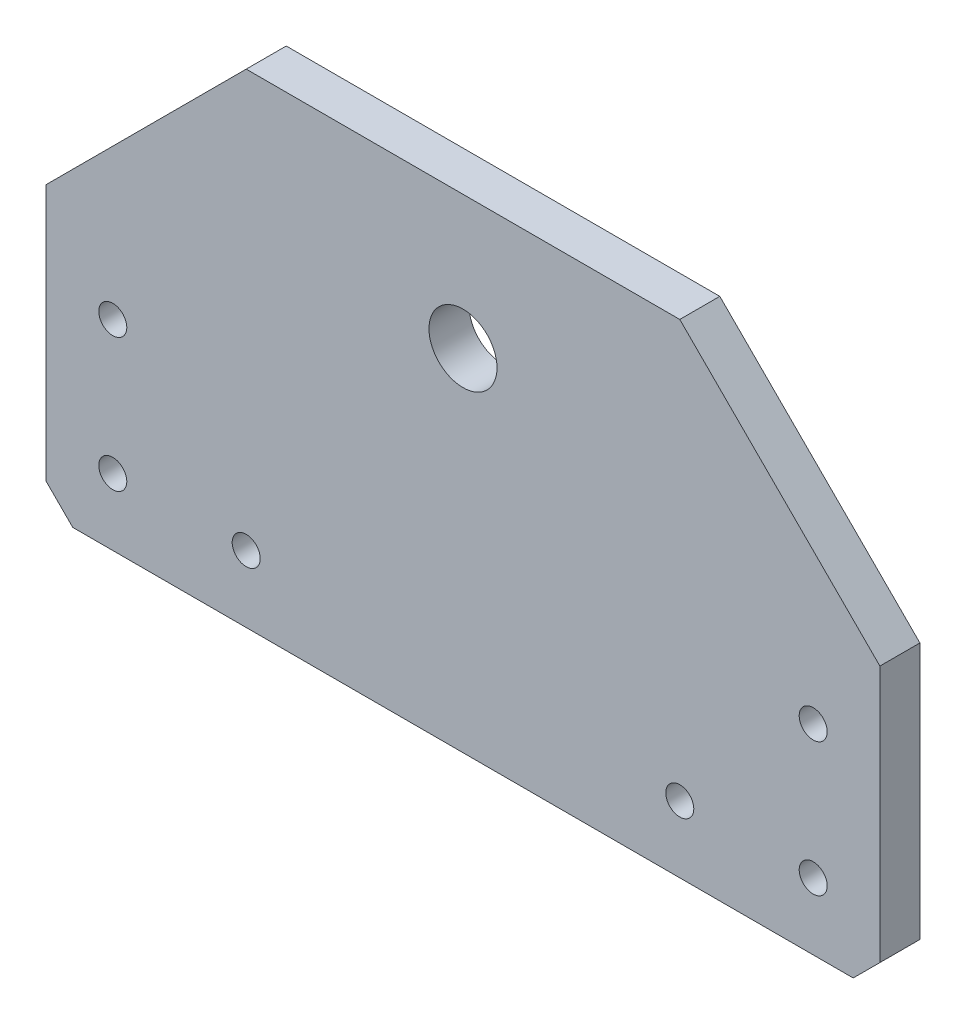
ISO-10303-21;
HEADER;
FILE_DESCRIPTION(('STEP AP214'),'2;1');
FILE_NAME('part.step','',(''),(''),'','','');
FILE_SCHEMA(('AUTOMOTIVE_DESIGN { 1 0 10303 214 1 1 1 1 }'));
ENDSEC;
DATA;
#1=APPLICATION_CONTEXT('core data for automotive mechanical design processes');
#2=APPLICATION_PROTOCOL_DEFINITION('international standard','automotive_design',2000,#1);
#3=PRODUCT_CONTEXT('',#1,'mechanical');
#4=PRODUCT('Part','Part','',(#3));
#5=PRODUCT_RELATED_PRODUCT_CATEGORY('part','',(#4));
#6=PRODUCT_DEFINITION_FORMATION('','',#4);
#7=PRODUCT_DEFINITION_CONTEXT('part definition',#1,'design');
#8=PRODUCT_DEFINITION('design','',#6,#7);
#9=PRODUCT_DEFINITION_SHAPE('','',#8);
#10=(LENGTH_UNIT() NAMED_UNIT(*) SI_UNIT(.MILLI.,.METRE.));
#11=(NAMED_UNIT(*) PLANE_ANGLE_UNIT() SI_UNIT($,.RADIAN.));
#12=(NAMED_UNIT(*) SI_UNIT($,.STERADIAN.) SOLID_ANGLE_UNIT());
#13=UNCERTAINTY_MEASURE_WITH_UNIT(LENGTH_MEASURE(1.E-05),#10,'distance_accuracy_value','');
#14=(GEOMETRIC_REPRESENTATION_CONTEXT(3) GLOBAL_UNCERTAINTY_ASSIGNED_CONTEXT((#13)) GLOBAL_UNIT_ASSIGNED_CONTEXT((#10,
#11,#12)) REPRESENTATION_CONTEXT('',''));
#15=CARTESIAN_POINT('',(0.,0.,0.));
#16=DIRECTION('',(0.,0.,1.));
#17=DIRECTION('',(1.,0.,0.));
#18=AXIS2_PLACEMENT_3D('',#15,#16,#17);
#19=CARTESIAN_POINT('',(0.,0.,3.));
#20=DIRECTION('',(0.,0.,1.));
#21=DIRECTION('',(1.,0.,0.));
#22=AXIS2_PLACEMENT_3D('',#19,#20,#21);
#23=PLANE('',#22);
#24=CARTESIAN_POINT('',(-52.5,-22.5,3.));
#25=DIRECTION('',(0.,0.,1.));
#26=DIRECTION('',(1.,0.,0.));
#27=AXIS2_PLACEMENT_3D('',#24,#25,#26);
#28=CIRCLE('',#27,2.1);
#29=CARTESIAN_POINT('',(-50.4,-22.5,3.));
#30=VERTEX_POINT('',#29);
#31=EDGE_CURVE('E291',#30,#30,#28,.T.);
#32=ORIENTED_EDGE('',*,*,#31,.F.);
#33=EDGE_LOOP('',(#32));
#34=FACE_BOUND('',#33,.T.);
#35=CARTESIAN_POINT('',(-52.5,-42.5,3.));
#36=DIRECTION('',(0.,0.,1.));
#37=DIRECTION('',(1.,0.,0.));
#38=AXIS2_PLACEMENT_3D('',#35,#36,#37);
#39=CIRCLE('',#38,2.09999999999999);
#40=CARTESIAN_POINT('',(-50.4,-42.5,3.));
#41=VERTEX_POINT('',#40);
#42=EDGE_CURVE('E299',#41,#41,#39,.T.);
#43=ORIENTED_EDGE('',*,*,#42,.F.);
#44=EDGE_LOOP('',(#43));
#45=FACE_BOUND('',#44,.T.);
#46=CARTESIAN_POINT('',(-32.5,-42.5,3.));
#47=DIRECTION('',(0.,0.,1.));
#48=DIRECTION('',(1.,0.,0.));
#49=AXIS2_PLACEMENT_3D('',#46,#47,#48);
#50=CIRCLE('',#49,2.1);
#51=CARTESIAN_POINT('',(-30.4,-42.5,3.));
#52=VERTEX_POINT('',#51);
#53=EDGE_CURVE('E309',#52,#52,#50,.T.);
#54=ORIENTED_EDGE('',*,*,#53,.F.);
#55=EDGE_LOOP('',(#54));
#56=FACE_BOUND('',#55,.T.);
#57=DIRECTION('',(1.,0.,0.));
#58=VECTOR('',#57,1.);
#59=CARTESIAN_POINT('',(-62.5,-52.5,3.));
#60=LINE('',#59,#58);
#61=CARTESIAN_POINT('',(-58.5,-52.5,3.));
#62=VERTEX_POINT('',#61);
#63=CARTESIAN_POINT('',(58.5,-52.5,3.));
#64=VERTEX_POINT('',#63);
#65=EDGE_CURVE('E322',#62,#64,#60,.T.);
#66=ORIENTED_EDGE('',*,*,#65,.T.);
#67=DIRECTION('',(-0.707106781186548,-0.707106781186547,0.));
#68=VECTOR('',#67,1.);
#69=CARTESIAN_POINT('',(55.5,-55.5000000000001,3.));
#70=LINE('',#69,#68);
#71=CARTESIAN_POINT('',(62.5,-48.5,3.));
#72=VERTEX_POINT('',#71);
#73=EDGE_CURVE('E165',#64,#72,#70,.F.);
#74=ORIENTED_EDGE('',*,*,#73,.T.);
#75=DIRECTION('',(0.,1.,0.));
#76=VECTOR('',#75,1.);
#77=CARTESIAN_POINT('',(62.5,-52.5,3.));
#78=LINE('',#77,#76);
#79=CARTESIAN_POINT('',(62.5,-10.0000000000001,3.));
#80=VERTEX_POINT('',#79);
#81=EDGE_CURVE('E123',#72,#80,#78,.T.);
#82=ORIENTED_EDGE('',*,*,#81,.T.);
#83=DIRECTION('',(0.707106781186546,-0.707106781186549,0.));
#84=VECTOR('',#83,1.);
#85=CARTESIAN_POINT('',(26.25,26.25,3.));
#86=LINE('',#85,#84);
#87=CARTESIAN_POINT('',(32.5,20.,3.));
#88=VERTEX_POINT('',#87);
#89=EDGE_CURVE('E146',#80,#88,#86,.F.);
#90=ORIENTED_EDGE('',*,*,#89,.T.);
#91=DIRECTION('',(-1.,0.,0.));
#92=VECTOR('',#91,1.);
#93=CARTESIAN_POINT('',(62.5,20.,3.));
#94=LINE('',#93,#92);
#95=CARTESIAN_POINT('',(-32.4999999999999,20.,3.));
#96=VERTEX_POINT('',#95);
#97=EDGE_CURVE('E139',#88,#96,#94,.T.);
#98=ORIENTED_EDGE('',*,*,#97,.T.);
#99=DIRECTION('',(0.707106781186549,0.707106781186546,0.));
#100=VECTOR('',#99,1.);
#101=CARTESIAN_POINT('',(-26.2499999999999,26.25,3.));
#102=LINE('',#101,#100);
#103=CARTESIAN_POINT('',(-62.5,-9.99999999999996,3.));
#104=VERTEX_POINT('',#103);
#105=EDGE_CURVE('E148',#96,#104,#102,.F.);
#106=ORIENTED_EDGE('',*,*,#105,.T.);
#107=DIRECTION('',(0.,-1.,0.));
#108=VECTOR('',#107,1.);
#109=CARTESIAN_POINT('',(-62.5,20.,3.));
#110=LINE('',#109,#108);
#111=CARTESIAN_POINT('',(-62.5,-48.5,3.));
#112=VERTEX_POINT('',#111);
#113=EDGE_CURVE('E122',#104,#112,#110,.T.);
#114=ORIENTED_EDGE('',*,*,#113,.T.);
#115=DIRECTION('',(-0.707106781186546,0.707106781186549,0.));
#116=VECTOR('',#115,1.);
#117=CARTESIAN_POINT('',(-55.5000000000001,-55.4999999999999,3.));
#118=LINE('',#117,#116);
#119=EDGE_CURVE('E163',#112,#62,#118,.F.);
#120=ORIENTED_EDGE('',*,*,#119,.T.);
#121=EDGE_LOOP('',(#66,#74,#82,#90,#98,#106,#114,#120));
#122=FACE_BOUND('',#121,.T.);
#123=CARTESIAN_POINT('',(0.,0.,3.));
#124=DIRECTION('',(0.,0.,1.));
#125=DIRECTION('',(1.,0.,0.));
#126=AXIS2_PLACEMENT_3D('',#123,#124,#125);
#127=CIRCLE('',#126,5.1);
#128=CARTESIAN_POINT('',(5.1,0.,3.));
#129=VERTEX_POINT('',#128);
#130=EDGE_CURVE('E135',#129,#129,#127,.T.);
#131=ORIENTED_EDGE('',*,*,#130,.F.);
#132=EDGE_LOOP('',(#131));
#133=FACE_BOUND('',#132,.T.);
#134=CARTESIAN_POINT('',(32.5,-42.5,3.));
#135=DIRECTION('',(0.,0.,1.));
#136=DIRECTION('',(1.,0.,0.));
#137=AXIS2_PLACEMENT_3D('',#134,#135,#136);
#138=CIRCLE('',#137,2.1);
#139=CARTESIAN_POINT('',(34.6,-42.5,3.));
#140=VERTEX_POINT('',#139);
#141=EDGE_CURVE('E303',#140,#140,#138,.T.);
#142=ORIENTED_EDGE('',*,*,#141,.F.);
#143=EDGE_LOOP('',(#142));
#144=FACE_BOUND('',#143,.T.);
#145=CARTESIAN_POINT('',(52.5,-42.5,3.));
#146=DIRECTION('',(0.,0.,1.));
#147=DIRECTION('',(1.,0.,0.));
#148=AXIS2_PLACEMENT_3D('',#145,#146,#147);
#149=CIRCLE('',#148,2.09999999999999);
#150=CARTESIAN_POINT('',(54.6,-42.5,3.));
#151=VERTEX_POINT('',#150);
#152=EDGE_CURVE('E294',#151,#151,#149,.T.);
#153=ORIENTED_EDGE('',*,*,#152,.F.);
#154=EDGE_LOOP('',(#153));
#155=FACE_BOUND('',#154,.T.);
#156=CARTESIAN_POINT('',(52.5,-22.5,3.));
#157=DIRECTION('',(0.,0.,1.));
#158=DIRECTION('',(1.,0.,0.));
#159=AXIS2_PLACEMENT_3D('',#156,#157,#158);
#160=CIRCLE('',#159,2.09999999999999);
#161=CARTESIAN_POINT('',(54.6,-22.5,3.));
#162=VERTEX_POINT('',#161);
#163=EDGE_CURVE('E289',#162,#162,#160,.T.);
#164=ORIENTED_EDGE('',*,*,#163,.F.);
#165=EDGE_LOOP('',(#164));
#166=FACE_BOUND('',#165,.T.);
#167=ADVANCED_FACE('F37',(#34,#45,#56,#122,#133,#144,#155,#166),#23,.T.);
#168=CARTESIAN_POINT('',(0.,0.,-3.));
#169=DIRECTION('',(0.,0.,1.));
#170=DIRECTION('',(1.,0.,0.));
#171=AXIS2_PLACEMENT_3D('',#168,#169,#170);
#172=PLANE('',#171);
#173=CARTESIAN_POINT('',(52.5,-42.5,-3.));
#174=DIRECTION('',(0.,0.,1.));
#175=DIRECTION('',(1.,0.,0.));
#176=AXIS2_PLACEMENT_3D('',#173,#174,#175);
#177=CIRCLE('',#176,4.09999999999997);
#178=CARTESIAN_POINT('',(56.6,-42.5,-3.));
#179=VERTEX_POINT('',#178);
#180=EDGE_CURVE('E177',#179,#179,#177,.T.);
#181=ORIENTED_EDGE('',*,*,#180,.T.);
#182=EDGE_LOOP('',(#181));
#183=FACE_BOUND('',#182,.T.);
#184=CARTESIAN_POINT('',(52.5,-22.5,-3.));
#185=DIRECTION('',(0.,0.,1.));
#186=DIRECTION('',(1.,0.,0.));
#187=AXIS2_PLACEMENT_3D('',#184,#185,#186);
#188=CIRCLE('',#187,4.09999999999997);
#189=CARTESIAN_POINT('',(56.6,-22.5,-3.));
#190=VERTEX_POINT('',#189);
#191=EDGE_CURVE('E174',#190,#190,#188,.T.);
#192=ORIENTED_EDGE('',*,*,#191,.T.);
#193=EDGE_LOOP('',(#192));
#194=FACE_BOUND('',#193,.T.);
#195=CARTESIAN_POINT('',(-52.5,-42.5,-3.));
#196=DIRECTION('',(0.,0.,1.));
#197=DIRECTION('',(1.,0.,0.));
#198=AXIS2_PLACEMENT_3D('',#195,#196,#197);
#199=CIRCLE('',#198,4.09999999999997);
#200=CARTESIAN_POINT('',(-48.4,-42.5,-3.));
#201=VERTEX_POINT('',#200);
#202=EDGE_CURVE('E171',#201,#201,#199,.T.);
#203=ORIENTED_EDGE('',*,*,#202,.T.);
#204=EDGE_LOOP('',(#203));
#205=FACE_BOUND('',#204,.T.);
#206=CARTESIAN_POINT('',(-52.5,-22.5,-3.));
#207=DIRECTION('',(0.,0.,1.));
#208=DIRECTION('',(1.,0.,0.));
#209=AXIS2_PLACEMENT_3D('',#206,#207,#208);
#210=CIRCLE('',#209,4.09999999999997);
#211=CARTESIAN_POINT('',(-48.4,-22.5,-3.));
#212=VERTEX_POINT('',#211);
#213=EDGE_CURVE('E168',#212,#212,#210,.T.);
#214=ORIENTED_EDGE('',*,*,#213,.T.);
#215=EDGE_LOOP('',(#214));
#216=FACE_BOUND('',#215,.T.);
#217=DIRECTION('',(0.,1.,0.));
#218=VECTOR('',#217,1.);
#219=CARTESIAN_POINT('',(62.5,-52.5,-3.));
#220=LINE('',#219,#218);
#221=CARTESIAN_POINT('',(62.5,-48.5,-3.));
#222=VERTEX_POINT('',#221);
#223=CARTESIAN_POINT('',(62.5,-10.0000000000001,-3.));
#224=VERTEX_POINT('',#223);
#225=EDGE_CURVE('E133',#222,#224,#220,.T.);
#226=ORIENTED_EDGE('',*,*,#225,.F.);
#227=DIRECTION('',(0.707106781186548,0.707106781186547,0.));
#228=VECTOR('',#227,1.);
#229=CARTESIAN_POINT('',(62.5,-48.5,-3.));
#230=LINE('',#229,#228);
#231=CARTESIAN_POINT('',(58.5,-52.5,-3.));
#232=VERTEX_POINT('',#231);
#233=EDGE_CURVE('E157',#222,#232,#230,.F.);
#234=ORIENTED_EDGE('',*,*,#233,.T.);
#235=DIRECTION('',(1.,0.,0.));
#236=VECTOR('',#235,1.);
#237=CARTESIAN_POINT('',(-62.5,-52.5,-3.));
#238=LINE('',#237,#236);
#239=CARTESIAN_POINT('',(-58.5,-52.5,-3.));
#240=VERTEX_POINT('',#239);
#241=EDGE_CURVE('E130',#240,#232,#238,.T.);
#242=ORIENTED_EDGE('',*,*,#241,.F.);
#243=DIRECTION('',(0.707106781186546,-0.707106781186549,0.));
#244=VECTOR('',#243,1.);
#245=CARTESIAN_POINT('',(-58.5,-52.5,-3.));
#246=LINE('',#245,#244);
#247=CARTESIAN_POINT('',(-62.5,-48.5,-3.));
#248=VERTEX_POINT('',#247);
#249=EDGE_CURVE('E129',#240,#248,#246,.F.);
#250=ORIENTED_EDGE('',*,*,#249,.T.);
#251=DIRECTION('',(0.,-1.,0.));
#252=VECTOR('',#251,1.);
#253=CARTESIAN_POINT('',(-62.5,20.,-3.));
#254=LINE('',#253,#252);
#255=CARTESIAN_POINT('',(-62.5,-9.99999999999996,-3.));
#256=VERTEX_POINT('',#255);
#257=EDGE_CURVE('E121',#256,#248,#254,.T.);
#258=ORIENTED_EDGE('',*,*,#257,.F.);
#259=DIRECTION('',(-0.707106781186549,-0.707106781186546,0.));
#260=VECTOR('',#259,1.);
#261=CARTESIAN_POINT('',(-62.5,-9.99999999999996,-3.));
#262=LINE('',#261,#260);
#263=CARTESIAN_POINT('',(-32.4999999999999,20.,-3.));
#264=VERTEX_POINT('',#263);
#265=EDGE_CURVE('E107',#256,#264,#262,.F.);
#266=ORIENTED_EDGE('',*,*,#265,.T.);
#267=DIRECTION('',(-1.,0.,0.));
#268=VECTOR('',#267,1.);
#269=CARTESIAN_POINT('',(62.5,20.,-3.));
#270=LINE('',#269,#268);
#271=CARTESIAN_POINT('',(32.5,20.,-3.));
#272=VERTEX_POINT('',#271);
#273=EDGE_CURVE('E131',#272,#264,#270,.T.);
#274=ORIENTED_EDGE('',*,*,#273,.F.);
#275=DIRECTION('',(-0.707106781186546,0.707106781186549,0.));
#276=VECTOR('',#275,1.);
#277=CARTESIAN_POINT('',(32.5,20.,-3.));
#278=LINE('',#277,#276);
#279=EDGE_CURVE('E118',#272,#224,#278,.F.);
#280=ORIENTED_EDGE('',*,*,#279,.T.);
#281=EDGE_LOOP('',(#226,#234,#242,#250,#258,#266,#274,#280));
#282=FACE_BOUND('',#281,.T.);
#283=CARTESIAN_POINT('',(0.,0.,-3.));
#284=DIRECTION('',(0.,0.,1.));
#285=DIRECTION('',(1.,0.,0.));
#286=AXIS2_PLACEMENT_3D('',#283,#284,#285);
#287=CIRCLE('',#286,5.1);
#288=CARTESIAN_POINT('',(5.1,0.,-3.));
#289=VERTEX_POINT('',#288);
#290=EDGE_CURVE('E312',#289,#289,#287,.T.);
#291=ORIENTED_EDGE('',*,*,#290,.T.);
#292=EDGE_LOOP('',(#291));
#293=FACE_BOUND('',#292,.T.);
#294=CARTESIAN_POINT('',(-32.5,-42.5,-3.));
#295=DIRECTION('',(0.,0.,1.));
#296=DIRECTION('',(1.,0.,0.));
#297=AXIS2_PLACEMENT_3D('',#294,#295,#296);
#298=CIRCLE('',#297,2.1);
#299=CARTESIAN_POINT('',(-30.4,-42.5,-3.));
#300=VERTEX_POINT('',#299);
#301=EDGE_CURVE('E306',#300,#300,#298,.T.);
#302=ORIENTED_EDGE('',*,*,#301,.T.);
#303=EDGE_LOOP('',(#302));
#304=FACE_BOUND('',#303,.T.);
#305=CARTESIAN_POINT('',(32.5,-42.5,-3.));
#306=DIRECTION('',(0.,0.,1.));
#307=DIRECTION('',(1.,0.,0.));
#308=AXIS2_PLACEMENT_3D('',#305,#306,#307);
#309=CIRCLE('',#308,2.1);
#310=CARTESIAN_POINT('',(34.6,-42.5,-3.));
#311=VERTEX_POINT('',#310);
#312=EDGE_CURVE('E302',#311,#311,#309,.T.);
#313=ORIENTED_EDGE('',*,*,#312,.T.);
#314=EDGE_LOOP('',(#313));
#315=FACE_BOUND('',#314,.T.);
#316=ADVANCED_FACE('F126',(#183,#194,#205,#216,#282,#293,#304,#315),#172,.F.);
#317=CARTESIAN_POINT('',(62.5,20.,3.));
#318=DIRECTION('',(0.,-1.,0.));
#319=DIRECTION('',(1.,0.,0.));
#320=AXIS2_PLACEMENT_3D('',#317,#318,#319);
#321=PLANE('',#320);
#322=ORIENTED_EDGE('',*,*,#273,.T.);
#323=DIRECTION('',(0.,0.,1.));
#324=VECTOR('',#323,1.);
#325=CARTESIAN_POINT('',(-32.4999999999999,20.,3.));
#326=LINE('',#325,#324);
#327=EDGE_CURVE('E112',#264,#96,#326,.T.);
#328=ORIENTED_EDGE('',*,*,#327,.T.);
#329=ORIENTED_EDGE('',*,*,#97,.F.);
#330=DIRECTION('',(0.,0.,-1.));
#331=VECTOR('',#330,1.);
#332=CARTESIAN_POINT('',(32.5,20.,3.));
#333=LINE('',#332,#331);
#334=EDGE_CURVE('E117',#88,#272,#333,.T.);
#335=ORIENTED_EDGE('',*,*,#334,.T.);
#336=EDGE_LOOP('',(#322,#328,#329,#335));
#337=FACE_BOUND('',#336,.T.);
#338=ADVANCED_FACE('F199',(#337),#321,.F.);
#339=CARTESIAN_POINT('',(-62.5,20.,3.));
#340=DIRECTION('',(1.,0.,0.));
#341=DIRECTION('',(0.,1.,0.));
#342=AXIS2_PLACEMENT_3D('',#339,#340,#341);
#343=PLANE('',#342);
#344=ORIENTED_EDGE('',*,*,#257,.T.);
#345=DIRECTION('',(0.,0.,1.));
#346=VECTOR('',#345,1.);
#347=CARTESIAN_POINT('',(-62.5,-48.5,3.));
#348=LINE('',#347,#346);
#349=EDGE_CURVE('E53',#248,#112,#348,.T.);
#350=ORIENTED_EDGE('',*,*,#349,.T.);
#351=ORIENTED_EDGE('',*,*,#113,.F.);
#352=DIRECTION('',(0.,0.,-1.));
#353=VECTOR('',#352,1.);
#354=CARTESIAN_POINT('',(-62.5,-9.99999999999996,3.));
#355=LINE('',#354,#353);
#356=EDGE_CURVE('E111',#104,#256,#355,.T.);
#357=ORIENTED_EDGE('',*,*,#356,.T.);
#358=EDGE_LOOP('',(#344,#350,#351,#357));
#359=FACE_BOUND('',#358,.T.);
#360=ADVANCED_FACE('F120',(#359),#343,.F.);
#361=CARTESIAN_POINT('',(-62.5,-52.5,3.));
#362=DIRECTION('',(0.,1.,0.));
#363=DIRECTION('',(0.,0.,1.));
#364=AXIS2_PLACEMENT_3D('',#361,#362,#363);
#365=PLANE('',#364);
#366=ORIENTED_EDGE('',*,*,#241,.T.);
#367=DIRECTION('',(0.,0.,1.));
#368=VECTOR('',#367,1.);
#369=CARTESIAN_POINT('',(58.5,-52.5,3.));
#370=LINE('',#369,#368);
#371=EDGE_CURVE('E61',#232,#64,#370,.T.);
#372=ORIENTED_EDGE('',*,*,#371,.T.);
#373=ORIENTED_EDGE('',*,*,#65,.F.);
#374=DIRECTION('',(0.,0.,-1.));
#375=VECTOR('',#374,1.);
#376=CARTESIAN_POINT('',(-58.5,-52.5,3.));
#377=LINE('',#376,#375);
#378=EDGE_CURVE('E159',#62,#240,#377,.T.);
#379=ORIENTED_EDGE('',*,*,#378,.T.);
#380=EDGE_LOOP('',(#366,#372,#373,#379));
#381=FACE_BOUND('',#380,.T.);
#382=ADVANCED_FACE('F223',(#381),#365,.F.);
#383=CARTESIAN_POINT('',(62.5,-52.5,3.));
#384=DIRECTION('',(-1.,0.,0.));
#385=DIRECTION('',(0.,-1.,0.));
#386=AXIS2_PLACEMENT_3D('',#383,#384,#385);
#387=PLANE('',#386);
#388=ORIENTED_EDGE('',*,*,#81,.F.);
#389=DIRECTION('',(0.,0.,-1.));
#390=VECTOR('',#389,1.);
#391=CARTESIAN_POINT('',(62.5,-48.5,3.));
#392=LINE('',#391,#390);
#393=EDGE_CURVE('E153',#72,#222,#392,.T.);
#394=ORIENTED_EDGE('',*,*,#393,.T.);
#395=ORIENTED_EDGE('',*,*,#225,.T.);
#396=DIRECTION('',(0.,0.,1.));
#397=VECTOR('',#396,1.);
#398=CARTESIAN_POINT('',(62.5,-10.0000000000001,3.));
#399=LINE('',#398,#397);
#400=EDGE_CURVE('E150',#224,#80,#399,.T.);
#401=ORIENTED_EDGE('',*,*,#400,.T.);
#402=EDGE_LOOP('',(#388,#394,#395,#401));
#403=FACE_BOUND('',#402,.T.);
#404=ADVANCED_FACE('F220',(#403),#387,.F.);
#405=CARTESIAN_POINT('',(0.,0.,3.));
#406=DIRECTION('',(0.,0.,-1.));
#407=DIRECTION('',(-1.,0.,0.));
#408=AXIS2_PLACEMENT_3D('',#405,#406,#407);
#409=CYLINDRICAL_SURFACE('',#408,5.1);
#410=ORIENTED_EDGE('',*,*,#130,.T.);
#411=EDGE_LOOP('',(#410));
#412=FACE_BOUND('',#411,.T.);
#413=ORIENTED_EDGE('',*,*,#290,.F.);
#414=EDGE_LOOP('',(#413));
#415=FACE_BOUND('',#414,.T.);
#416=ADVANCED_FACE('F217',(#412,#415),#409,.F.);
#417=CARTESIAN_POINT('',(-32.5,-42.5,3.));
#418=DIRECTION('',(0.,0.,-1.));
#419=DIRECTION('',(-1.,0.,0.));
#420=AXIS2_PLACEMENT_3D('',#417,#418,#419);
#421=CYLINDRICAL_SURFACE('',#420,2.1);
#422=ORIENTED_EDGE('',*,*,#53,.T.);
#423=EDGE_LOOP('',(#422));
#424=FACE_BOUND('',#423,.T.);
#425=ORIENTED_EDGE('',*,*,#301,.F.);
#426=EDGE_LOOP('',(#425));
#427=FACE_BOUND('',#426,.T.);
#428=ADVANCED_FACE('F354',(#424,#427),#421,.F.);
#429=CARTESIAN_POINT('',(32.5,-42.5,3.));
#430=DIRECTION('',(0.,0.,-1.));
#431=DIRECTION('',(-1.,0.,0.));
#432=AXIS2_PLACEMENT_3D('',#429,#430,#431);
#433=CYLINDRICAL_SURFACE('',#432,2.1);
#434=ORIENTED_EDGE('',*,*,#141,.T.);
#435=EDGE_LOOP('',(#434));
#436=FACE_BOUND('',#435,.T.);
#437=ORIENTED_EDGE('',*,*,#312,.F.);
#438=EDGE_LOOP('',(#437));
#439=FACE_BOUND('',#438,.T.);
#440=ADVANCED_FACE('F350',(#436,#439),#433,.F.);
#441=CARTESIAN_POINT('',(-52.5,-42.5,3.));
#442=DIRECTION('',(0.,0.,-1.));
#443=DIRECTION('',(-1.,0.,0.));
#444=AXIS2_PLACEMENT_3D('',#441,#442,#443);
#445=CYLINDRICAL_SURFACE('',#444,2.09999999999999);
#446=CARTESIAN_POINT('',(-52.5,-42.5,-1.00000000000002));
#447=DIRECTION('',(0.,0.,1.));
#448=DIRECTION('',(1.,0.,0.));
#449=AXIS2_PLACEMENT_3D('',#446,#447,#448);
#450=CIRCLE('',#449,2.09999999999999);
#451=CARTESIAN_POINT('',(-50.4,-42.5,-1.00000000000002));
#452=VERTEX_POINT('',#451);
#453=EDGE_CURVE('E46',#452,#452,#450,.F.);
#454=ORIENTED_EDGE('',*,*,#453,.T.);
#455=EDGE_LOOP('',(#454));
#456=FACE_BOUND('',#455,.T.);
#457=ORIENTED_EDGE('',*,*,#42,.T.);
#458=EDGE_LOOP('',(#457));
#459=FACE_BOUND('',#458,.T.);
#460=ADVANCED_FACE('F188',(#456,#459),#445,.F.);
#461=CARTESIAN_POINT('',(52.5,-42.5,3.));
#462=DIRECTION('',(0.,0.,-1.));
#463=DIRECTION('',(-1.,0.,0.));
#464=AXIS2_PLACEMENT_3D('',#461,#462,#463);
#465=CYLINDRICAL_SURFACE('',#464,2.09999999999999);
#466=CARTESIAN_POINT('',(52.5,-42.5,-1.00000000000002));
#467=DIRECTION('',(0.,0.,1.));
#468=DIRECTION('',(1.,0.,0.));
#469=AXIS2_PLACEMENT_3D('',#466,#467,#468);
#470=CIRCLE('',#469,2.09999999999999);
#471=CARTESIAN_POINT('',(54.6,-42.5,-1.00000000000002));
#472=VERTEX_POINT('',#471);
#473=EDGE_CURVE('E180',#472,#472,#470,.F.);
#474=ORIENTED_EDGE('',*,*,#473,.T.);
#475=EDGE_LOOP('',(#474));
#476=FACE_BOUND('',#475,.T.);
#477=ORIENTED_EDGE('',*,*,#152,.T.);
#478=EDGE_LOOP('',(#477));
#479=FACE_BOUND('',#478,.T.);
#480=ADVANCED_FACE('F340',(#476,#479),#465,.F.);
#481=CARTESIAN_POINT('',(-52.5,-22.5,3.));
#482=DIRECTION('',(0.,0.,-1.));
#483=DIRECTION('',(-1.,0.,0.));
#484=AXIS2_PLACEMENT_3D('',#481,#482,#483);
#485=CYLINDRICAL_SURFACE('',#484,2.1);
#486=CARTESIAN_POINT('',(-52.5,-22.5,-1.00000000000003));
#487=DIRECTION('',(0.,0.,1.));
#488=DIRECTION('',(1.,0.,0.));
#489=AXIS2_PLACEMENT_3D('',#486,#487,#488);
#490=CIRCLE('',#489,2.1);
#491=CARTESIAN_POINT('',(-50.4,-22.5,-1.00000000000003));
#492=VERTEX_POINT('',#491);
#493=EDGE_CURVE('E11',#492,#492,#490,.F.);
#494=ORIENTED_EDGE('',*,*,#493,.T.);
#495=EDGE_LOOP('',(#494));
#496=FACE_BOUND('',#495,.T.);
#497=ORIENTED_EDGE('',*,*,#31,.T.);
#498=EDGE_LOOP('',(#497));
#499=FACE_BOUND('',#498,.T.);
#500=ADVANCED_FACE('F285',(#496,#499),#485,.F.);
#501=CARTESIAN_POINT('',(52.5,-22.5,3.));
#502=DIRECTION('',(0.,0.,-1.));
#503=DIRECTION('',(-1.,0.,0.));
#504=AXIS2_PLACEMENT_3D('',#501,#502,#503);
#505=CYLINDRICAL_SURFACE('',#504,2.09999999999999);
#506=CARTESIAN_POINT('',(52.5,-22.5,-1.00000000000002));
#507=DIRECTION('',(0.,0.,1.));
#508=DIRECTION('',(1.,0.,0.));
#509=AXIS2_PLACEMENT_3D('',#506,#507,#508);
#510=CIRCLE('',#509,2.09999999999999);
#511=CARTESIAN_POINT('',(54.6,-22.5,-1.00000000000002));
#512=VERTEX_POINT('',#511);
#513=EDGE_CURVE('E183',#512,#512,#510,.F.);
#514=ORIENTED_EDGE('',*,*,#513,.T.);
#515=EDGE_LOOP('',(#514));
#516=FACE_BOUND('',#515,.T.);
#517=ORIENTED_EDGE('',*,*,#163,.T.);
#518=EDGE_LOOP('',(#517));
#519=FACE_BOUND('',#518,.T.);
#520=ADVANCED_FACE('F239',(#516,#519),#505,.F.);
#521=CARTESIAN_POINT('',(-62.5,-9.99999999999996,3.));
#522=DIRECTION('',(0.707106781186546,-0.707106781186549,0.));
#523=DIRECTION('',(0.,0.,-1.));
#524=AXIS2_PLACEMENT_3D('',#521,#522,#523);
#525=PLANE('',#524);
#526=ORIENTED_EDGE('',*,*,#105,.F.);
#527=ORIENTED_EDGE('',*,*,#327,.F.);
#528=ORIENTED_EDGE('',*,*,#265,.F.);
#529=ORIENTED_EDGE('',*,*,#356,.F.);
#530=EDGE_LOOP('',(#526,#527,#528,#529));
#531=FACE_BOUND('',#530,.T.);
#532=ADVANCED_FACE('F110',(#531),#525,.F.);
#533=CARTESIAN_POINT('',(32.5,20.,3.));
#534=DIRECTION('',(-0.707106781186549,-0.707106781186546,0.));
#535=DIRECTION('',(0.,0.,-1.));
#536=AXIS2_PLACEMENT_3D('',#533,#534,#535);
#537=PLANE('',#536);
#538=ORIENTED_EDGE('',*,*,#89,.F.);
#539=ORIENTED_EDGE('',*,*,#400,.F.);
#540=ORIENTED_EDGE('',*,*,#279,.F.);
#541=ORIENTED_EDGE('',*,*,#334,.F.);
#542=EDGE_LOOP('',(#538,#539,#540,#541));
#543=FACE_BOUND('',#542,.T.);
#544=ADVANCED_FACE('F238',(#543),#537,.F.);
#545=CARTESIAN_POINT('',(62.5,-48.5,3.));
#546=DIRECTION('',(-0.707106781186547,0.707106781186548,0.));
#547=DIRECTION('',(0.,0.,-1.));
#548=AXIS2_PLACEMENT_3D('',#545,#546,#547);
#549=PLANE('',#548);
#550=ORIENTED_EDGE('',*,*,#73,.F.);
#551=ORIENTED_EDGE('',*,*,#371,.F.);
#552=ORIENTED_EDGE('',*,*,#233,.F.);
#553=ORIENTED_EDGE('',*,*,#393,.F.);
#554=EDGE_LOOP('',(#550,#551,#552,#553));
#555=FACE_BOUND('',#554,.T.);
#556=ADVANCED_FACE('F245',(#555),#549,.F.);
#557=CARTESIAN_POINT('',(-58.5,-52.5,3.));
#558=DIRECTION('',(0.707106781186549,0.707106781186546,0.));
#559=DIRECTION('',(0.,0.,-1.));
#560=AXIS2_PLACEMENT_3D('',#557,#558,#559);
#561=PLANE('',#560);
#562=ORIENTED_EDGE('',*,*,#119,.F.);
#563=ORIENTED_EDGE('',*,*,#349,.F.);
#564=ORIENTED_EDGE('',*,*,#249,.F.);
#565=ORIENTED_EDGE('',*,*,#378,.F.);
#566=EDGE_LOOP('',(#562,#563,#564,#565));
#567=FACE_BOUND('',#566,.T.);
#568=ADVANCED_FACE('F252',(#567),#561,.F.);
#569=CARTESIAN_POINT('',(52.5,-42.5,-3.));
#570=DIRECTION('',(0.,0.,-1.));
#571=DIRECTION('',(-1.,0.,0.));
#572=AXIS2_PLACEMENT_3D('',#569,#570,#571);
#573=CONICAL_SURFACE('',#572,4.09999999999997,0.785398163397447);
#574=ORIENTED_EDGE('',*,*,#473,.F.);
#575=EDGE_LOOP('',(#574));
#576=FACE_BOUND('',#575,.T.);
#577=ORIENTED_EDGE('',*,*,#180,.F.);
#578=EDGE_LOOP('',(#577));
#579=FACE_BOUND('',#578,.T.);
#580=ADVANCED_FACE('F259',(#576,#579),#573,.F.);
#581=CARTESIAN_POINT('',(52.5,-22.5,-3.));
#582=DIRECTION('',(0.,0.,-1.));
#583=DIRECTION('',(-1.,0.,0.));
#584=AXIS2_PLACEMENT_3D('',#581,#582,#583);
#585=CONICAL_SURFACE('',#584,4.09999999999997,0.785398163397447);
#586=ORIENTED_EDGE('',*,*,#513,.F.);
#587=EDGE_LOOP('',(#586));
#588=FACE_BOUND('',#587,.T.);
#589=ORIENTED_EDGE('',*,*,#191,.F.);
#590=EDGE_LOOP('',(#589));
#591=FACE_BOUND('',#590,.T.);
#592=ADVANCED_FACE('F194',(#588,#591),#585,.F.);
#593=CARTESIAN_POINT('',(-52.5,-42.5,-3.));
#594=DIRECTION('',(0.,0.,-1.));
#595=DIRECTION('',(-1.,0.,0.));
#596=AXIS2_PLACEMENT_3D('',#593,#594,#595);
#597=CONICAL_SURFACE('',#596,4.09999999999997,0.785398163397447);
#598=ORIENTED_EDGE('',*,*,#453,.F.);
#599=EDGE_LOOP('',(#598));
#600=FACE_BOUND('',#599,.T.);
#601=ORIENTED_EDGE('',*,*,#202,.F.);
#602=EDGE_LOOP('',(#601));
#603=FACE_BOUND('',#602,.T.);
#604=ADVANCED_FACE('F191',(#600,#603),#597,.F.);
#605=CARTESIAN_POINT('',(-52.5,-22.5,-3.));
#606=DIRECTION('',(0.,0.,-1.));
#607=DIRECTION('',(-1.,0.,0.));
#608=AXIS2_PLACEMENT_3D('',#605,#606,#607);
#609=CONICAL_SURFACE('',#608,4.09999999999997,0.785398163397447);
#610=ORIENTED_EDGE('',*,*,#493,.F.);
#611=EDGE_LOOP('',(#610));
#612=FACE_BOUND('',#611,.T.);
#613=ORIENTED_EDGE('',*,*,#213,.F.);
#614=EDGE_LOOP('',(#613));
#615=FACE_BOUND('',#614,.T.);
#616=ADVANCED_FACE('F40',(#612,#615),#609,.F.);
#617=CLOSED_SHELL('',(#167,#316,#338,#360,#382,#404,#416,#428,#440,#460,#480,#500,#520,#532,
#544,#556,#568,#580,#592,#604,#616));
#618=MANIFOLD_SOLID_BREP('B2',#617);
#619=ADVANCED_BREP_SHAPE_REPRESENTATION('',(#18,#618),#14);
#620=SHAPE_DEFINITION_REPRESENTATION(#9,#619);
ENDSEC;
END-ISO-10303-21;
